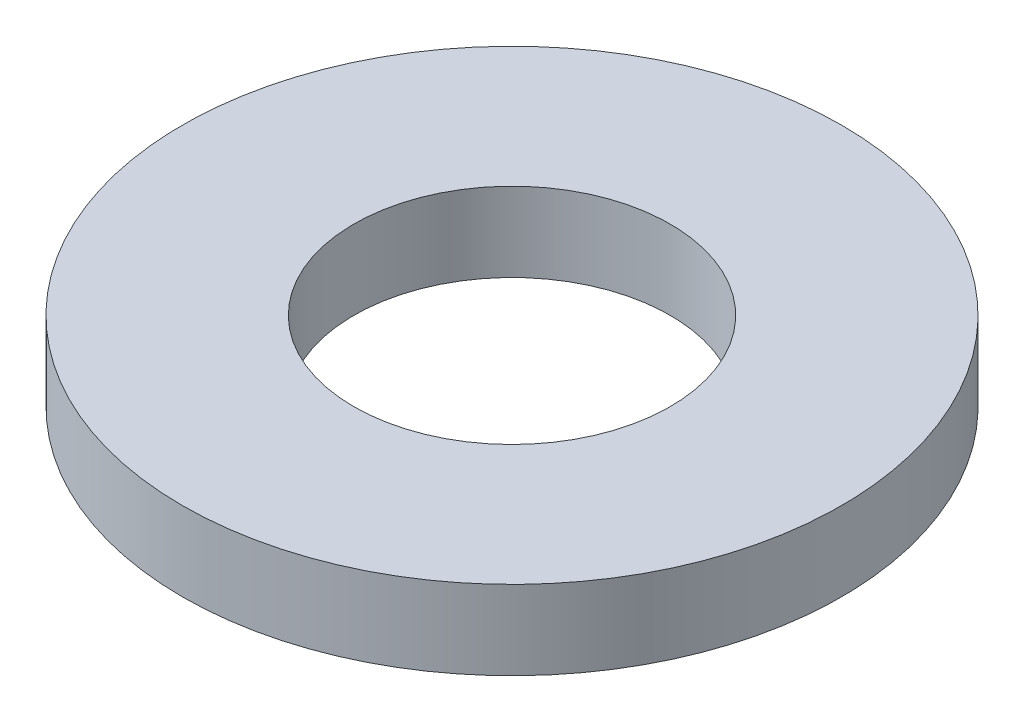
ISO-10303-21;
HEADER;
FILE_DESCRIPTION(('STEP AP214'),'2;1');
FILE_NAME('part.step','',(''),(''),'','','');
FILE_SCHEMA(('AUTOMOTIVE_DESIGN { 1 0 10303 214 1 1 1 1 }'));
ENDSEC;
DATA;
#1=APPLICATION_CONTEXT('core data for automotive mechanical design processes');
#2=APPLICATION_PROTOCOL_DEFINITION('international standard','automotive_design',2000,#1);
#3=PRODUCT_CONTEXT('',#1,'mechanical');
#4=PRODUCT('Part','Part','',(#3));
#5=PRODUCT_RELATED_PRODUCT_CATEGORY('part','',(#4));
#6=PRODUCT_DEFINITION_FORMATION('','',#4);
#7=PRODUCT_DEFINITION_CONTEXT('part definition',#1,'design');
#8=PRODUCT_DEFINITION('design','',#6,#7);
#9=PRODUCT_DEFINITION_SHAPE('','',#8);
#10=(LENGTH_UNIT() NAMED_UNIT(*) SI_UNIT(.MILLI.,.METRE.));
#11=(NAMED_UNIT(*) PLANE_ANGLE_UNIT() SI_UNIT($,.RADIAN.));
#12=(NAMED_UNIT(*) SI_UNIT($,.STERADIAN.) SOLID_ANGLE_UNIT());
#13=UNCERTAINTY_MEASURE_WITH_UNIT(LENGTH_MEASURE(1.E-05),#10,'distance_accuracy_value','');
#14=(GEOMETRIC_REPRESENTATION_CONTEXT(3) GLOBAL_UNCERTAINTY_ASSIGNED_CONTEXT((#13)) GLOBAL_UNIT_ASSIGNED_CONTEXT((#10,
#11,#12)) REPRESENTATION_CONTEXT('',''));
#15=CARTESIAN_POINT('',(0.,0.,0.));
#16=DIRECTION('',(0.,0.,1.));
#17=DIRECTION('',(1.,0.,0.));
#18=AXIS2_PLACEMENT_3D('',#15,#16,#17);
#19=CARTESIAN_POINT('',(0.,1.5,0.));
#20=DIRECTION('',(0.,1.,0.));
#21=DIRECTION('',(0.,0.,1.));
#22=AXIS2_PLACEMENT_3D('',#19,#20,#21);
#23=PLANE('',#22);
#24=CARTESIAN_POINT('',(0.,1.5,0.));
#25=DIRECTION('',(0.,1.,0.));
#26=DIRECTION('',(0.,0.,1.));
#27=AXIS2_PLACEMENT_3D('',#24,#25,#26);
#28=CIRCLE('',#27,12.5);
#29=CARTESIAN_POINT('',(0.,1.5,12.5));
#30=VERTEX_POINT('',#29);
#31=EDGE_CURVE('E10',#30,#30,#28,.T.);
#32=ORIENTED_EDGE('',*,*,#31,.T.);
#33=EDGE_LOOP('',(#32));
#34=FACE_BOUND('',#33,.T.);
#35=CARTESIAN_POINT('',(0.,1.5,0.));
#36=DIRECTION('',(0.,1.,0.));
#37=DIRECTION('',(0.,0.,1.));
#38=AXIS2_PLACEMENT_3D('',#35,#36,#37);
#39=CIRCLE('',#38,6.);
#40=CARTESIAN_POINT('',(0.,1.5,6.));
#41=VERTEX_POINT('',#40);
#42=EDGE_CURVE('E48',#41,#41,#39,.T.);
#43=ORIENTED_EDGE('',*,*,#42,.F.);
#44=EDGE_LOOP('',(#43));
#45=FACE_BOUND('',#44,.T.);
#46=ADVANCED_FACE('F37',(#34,#45),#23,.T.);
#47=CARTESIAN_POINT('',(0.,-1.5,0.));
#48=DIRECTION('',(0.,1.,0.));
#49=DIRECTION('',(0.,0.,1.));
#50=AXIS2_PLACEMENT_3D('',#47,#48,#49);
#51=PLANE('',#50);
#52=CARTESIAN_POINT('',(0.,-1.5,0.));
#53=DIRECTION('',(0.,1.,0.));
#54=DIRECTION('',(0.,0.,1.));
#55=AXIS2_PLACEMENT_3D('',#52,#53,#54);
#56=CIRCLE('',#55,12.5);
#57=CARTESIAN_POINT('',(0.,-1.5,12.5));
#58=VERTEX_POINT('',#57);
#59=EDGE_CURVE('E41',#58,#58,#56,.T.);
#60=ORIENTED_EDGE('',*,*,#59,.F.);
#61=EDGE_LOOP('',(#60));
#62=FACE_BOUND('',#61,.T.);
#63=CARTESIAN_POINT('',(0.,-1.5,0.));
#64=DIRECTION('',(0.,1.,0.));
#65=DIRECTION('',(0.,0.,1.));
#66=AXIS2_PLACEMENT_3D('',#63,#64,#65);
#67=CIRCLE('',#66,6.);
#68=CARTESIAN_POINT('',(0.,-1.5,6.));
#69=VERTEX_POINT('',#68);
#70=EDGE_CURVE('E50',#69,#69,#67,.T.);
#71=ORIENTED_EDGE('',*,*,#70,.T.);
#72=EDGE_LOOP('',(#71));
#73=FACE_BOUND('',#72,.T.);
#74=ADVANCED_FACE('F60',(#62,#73),#51,.F.);
#75=CARTESIAN_POINT('',(0.,1.5,0.));
#76=DIRECTION('',(0.,-1.,0.));
#77=DIRECTION('',(0.,0.,-1.));
#78=AXIS2_PLACEMENT_3D('',#75,#76,#77);
#79=CYLINDRICAL_SURFACE('',#78,12.5);
#80=ORIENTED_EDGE('',*,*,#31,.F.);
#81=EDGE_LOOP('',(#80));
#82=FACE_BOUND('',#81,.T.);
#83=ORIENTED_EDGE('',*,*,#59,.T.);
#84=EDGE_LOOP('',(#83));
#85=FACE_BOUND('',#84,.T.);
#86=ADVANCED_FACE('F39',(#82,#85),#79,.T.);
#87=CARTESIAN_POINT('',(0.,1.5,0.));
#88=DIRECTION('',(0.,-1.,0.));
#89=DIRECTION('',(0.,0.,-1.));
#90=AXIS2_PLACEMENT_3D('',#87,#88,#89);
#91=CYLINDRICAL_SURFACE('',#90,6.);
#92=ORIENTED_EDGE('',*,*,#42,.T.);
#93=EDGE_LOOP('',(#92));
#94=FACE_BOUND('',#93,.T.);
#95=ORIENTED_EDGE('',*,*,#70,.F.);
#96=EDGE_LOOP('',(#95));
#97=FACE_BOUND('',#96,.T.);
#98=ADVANCED_FACE('F56',(#94,#97),#91,.F.);
#99=CLOSED_SHELL('',(#46,#74,#86,#98));
#100=MANIFOLD_SOLID_BREP('B2',#99);
#101=ADVANCED_BREP_SHAPE_REPRESENTATION('',(#18,#100),#14);
#102=SHAPE_DEFINITION_REPRESENTATION(#9,#101);
ENDSEC;
END-ISO-10303-21;
